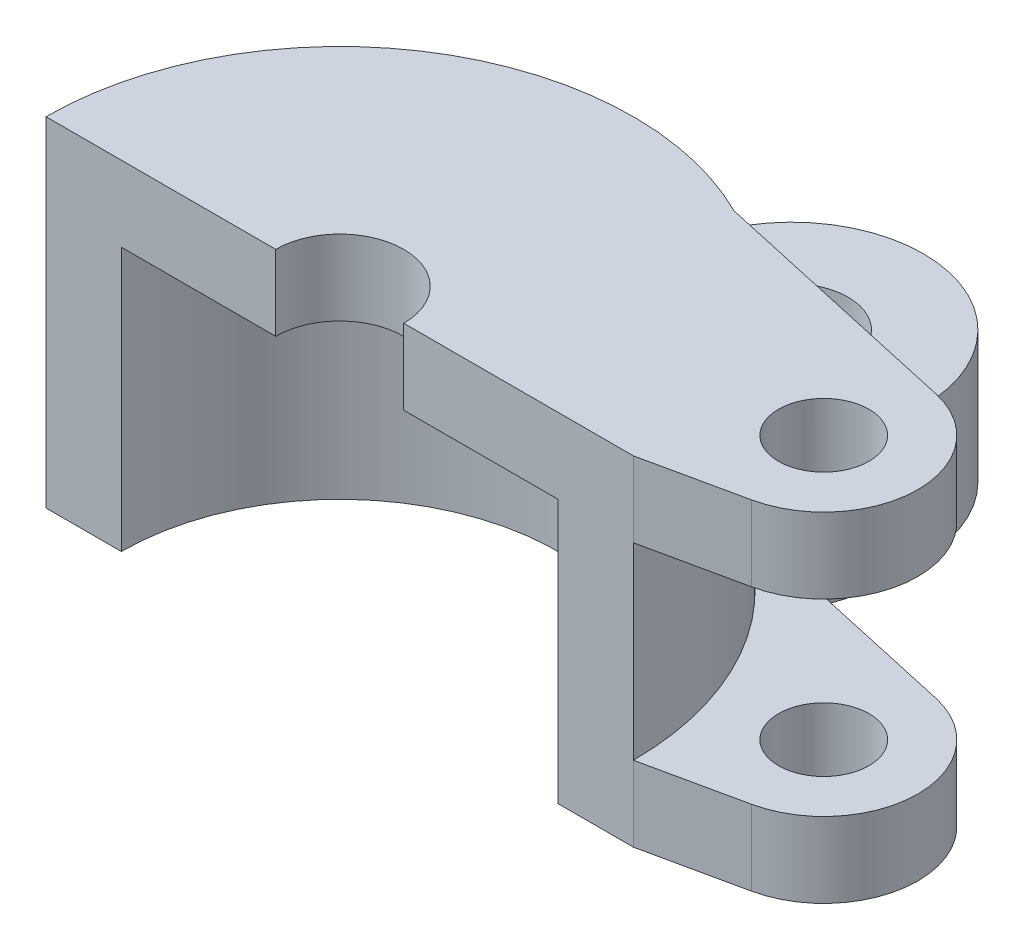
ISO-10303-21;
HEADER;
FILE_DESCRIPTION(('STEP AP214'),'2;1');
FILE_NAME('part.step','',(''),(''),'','','');
FILE_SCHEMA(('AUTOMOTIVE_DESIGN { 1 0 10303 214 1 1 1 1 }'));
ENDSEC;
DATA;
#1=APPLICATION_CONTEXT('core data for automotive mechanical design processes');
#2=APPLICATION_PROTOCOL_DEFINITION('international standard','automotive_design',2000,#1);
#3=PRODUCT_CONTEXT('',#1,'mechanical');
#4=PRODUCT('Part','Part','',(#3));
#5=PRODUCT_RELATED_PRODUCT_CATEGORY('part','',(#4));
#6=PRODUCT_DEFINITION_FORMATION('','',#4);
#7=PRODUCT_DEFINITION_CONTEXT('part definition',#1,'design');
#8=PRODUCT_DEFINITION('design','',#6,#7);
#9=PRODUCT_DEFINITION_SHAPE('','',#8);
#10=(LENGTH_UNIT() NAMED_UNIT(*) SI_UNIT(.MILLI.,.METRE.));
#11=(NAMED_UNIT(*) PLANE_ANGLE_UNIT() SI_UNIT($,.RADIAN.));
#12=(NAMED_UNIT(*) SI_UNIT($,.STERADIAN.) SOLID_ANGLE_UNIT());
#13=UNCERTAINTY_MEASURE_WITH_UNIT(LENGTH_MEASURE(1.E-05),#10,'distance_accuracy_value','');
#14=(GEOMETRIC_REPRESENTATION_CONTEXT(3) GLOBAL_UNCERTAINTY_ASSIGNED_CONTEXT((#13)) GLOBAL_UNIT_ASSIGNED_CONTEXT((#10,
#11,#12)) REPRESENTATION_CONTEXT('',''));
#15=CARTESIAN_POINT('',(0.,0.,0.));
#16=DIRECTION('',(0.,0.,1.));
#17=DIRECTION('',(1.,0.,0.));
#18=AXIS2_PLACEMENT_3D('',#15,#16,#17);
#19=CARTESIAN_POINT('',(7.8,20.2682362594864,0.));
#20=DIRECTION('',(0.21069833227543,0.,0.977551130517659));
#21=DIRECTION('',(0.977551130517659,0.,-0.21069833227543));
#22=AXIS2_PLACEMENT_3D('',#19,#20,#21);
#23=PLANE('',#22);
#24=DIRECTION('',(0.,-1.,0.));
#25=VECTOR('',#24,1.);
#26=CARTESIAN_POINT('',(7.8,7.,0.));
#27=LINE('',#26,#25);
#28=CARTESIAN_POINT('',(7.8,9.,0.));
#29=VERTEX_POINT('',#28);
#30=CARTESIAN_POINT('',(7.8,7.,0.));
#31=VERTEX_POINT('',#30);
#32=EDGE_CURVE('E215',#29,#31,#27,.T.);
#33=ORIENTED_EDGE('',*,*,#32,.T.);
#34=DIRECTION('',(-0.977551130517659,0.,0.21069833227543));
#35=VECTOR('',#34,1.);
#36=CARTESIAN_POINT('',(10.3801716308862,7.,-0.556122173705854));
#37=LINE('',#36,#35);
#38=CARTESIAN_POINT('',(10.3801716308862,7.,-0.556122173705854));
#39=VERTEX_POINT('',#38);
#40=EDGE_CURVE('E199',#39,#31,#37,.T.);
#41=ORIENTED_EDGE('',*,*,#40,.F.);
#42=DIRECTION('',(0.,-1.,0.));
#43=VECTOR('',#42,1.);
#44=CARTESIAN_POINT('',(10.3801716308862,20.2682362594864,-0.556122173705854));
#45=LINE('',#44,#43);
#46=CARTESIAN_POINT('',(10.3801716308862,9.,-0.556122173705854));
#47=VERTEX_POINT('',#46);
#48=EDGE_CURVE('E212',#47,#39,#45,.T.);
#49=ORIENTED_EDGE('',*,*,#48,.F.);
#50=DIRECTION('',(-0.977551130517659,0.,0.21069833227543));
#51=VECTOR('',#50,1.);
#52=CARTESIAN_POINT('',(7.8,9.,0.));
#53=LINE('',#52,#51);
#54=EDGE_CURVE('E241',#47,#29,#53,.T.);
#55=ORIENTED_EDGE('',*,*,#54,.T.);
#56=EDGE_LOOP('',(#33,#41,#49,#55));
#57=FACE_BOUND('',#56,.T.);
#58=ADVANCED_FACE('F42',(#57),#23,.T.);
#59=CARTESIAN_POINT('',(9.85342580019761,20.2682362594864,-3.));
#60=DIRECTION('',(0.,-1.,0.));
#61=DIRECTION('',(0.,0.,-1.));
#62=AXIS2_PLACEMENT_3D('',#59,#60,#61);
#63=CYLINDRICAL_SURFACE('',#62,2.5);
#64=ORIENTED_EDGE('',*,*,#48,.T.);
#65=CARTESIAN_POINT('',(9.85342580019761,7.,-3.));
#66=DIRECTION('',(0.,-1.,0.));
#67=DIRECTION('',(0.,0.,-1.));
#68=AXIS2_PLACEMENT_3D('',#65,#66,#67);
#69=CIRCLE('',#68,2.5);
#70=CARTESIAN_POINT('',(10.395008451767,7.,-5.44063275228352));
#71=VERTEX_POINT('',#70);
#72=EDGE_CURVE('E195',#71,#39,#69,.T.);
#73=ORIENTED_EDGE('',*,*,#72,.F.);
#74=DIRECTION('',(0.,-1.,0.));
#75=VECTOR('',#74,1.);
#76=CARTESIAN_POINT('',(10.395008451767,20.2682362594864,-5.44063275228352));
#77=LINE('',#76,#75);
#78=CARTESIAN_POINT('',(10.395008451767,9.,-5.44063275228352));
#79=VERTEX_POINT('',#78);
#80=EDGE_CURVE('E233',#79,#71,#77,.T.);
#81=ORIENTED_EDGE('',*,*,#80,.F.);
#82=CARTESIAN_POINT('',(9.85342580019761,9.,-3.));
#83=DIRECTION('',(0.,1.,0.));
#84=DIRECTION('',(0.,0.,1.));
#85=AXIS2_PLACEMENT_3D('',#82,#83,#84);
#86=CIRCLE('',#85,2.5);
#87=EDGE_CURVE('E220',#79,#47,#86,.F.);
#88=ORIENTED_EDGE('',*,*,#87,.T.);
#89=EDGE_LOOP('',(#64,#73,#81,#88));
#90=FACE_BOUND('',#89,.T.);
#91=ADVANCED_FACE('F219',(#90),#63,.T.);
#92=CARTESIAN_POINT('',(3.5,20.2682362594864,-6.97065276713738));
#93=DIRECTION('',(0.216633060627773,0.,-0.976253100913407));
#94=DIRECTION('',(-0.976253100913408,0.,-0.216633060627773));
#95=AXIS2_PLACEMENT_3D('',#92,#93,#94);
#96=PLANE('',#95);
#97=ORIENTED_EDGE('',*,*,#80,.T.);
#98=DIRECTION('',(0.976253100913407,0.,0.216633060627773));
#99=VECTOR('',#98,1.);
#100=CARTESIAN_POINT('',(3.5,7.,-6.97065276713738));
#101=LINE('',#100,#99);
#102=CARTESIAN_POINT('',(3.5,6.99999999999962,-6.97065276713738));
#103=VERTEX_POINT('',#102);
#104=EDGE_CURVE('E202',#103,#71,#101,.T.);
#105=ORIENTED_EDGE('',*,*,#104,.F.);
#106=DIRECTION('',(0.,-1.,0.));
#107=VECTOR('',#106,1.);
#108=CARTESIAN_POINT('',(3.5,20.2682362594864,-6.97065276713738));
#109=LINE('',#108,#107);
#110=CARTESIAN_POINT('',(3.5,9.,-6.97065276713738));
#111=VERTEX_POINT('',#110);
#112=EDGE_CURVE('E237',#111,#103,#109,.T.);
#113=ORIENTED_EDGE('',*,*,#112,.F.);
#114=DIRECTION('',(0.976253100913408,0.,0.216633060627773));
#115=VECTOR('',#114,1.);
#116=CARTESIAN_POINT('',(3.5,9.,-6.97065276713738));
#117=LINE('',#116,#115);
#118=EDGE_CURVE('E222',#111,#79,#117,.T.);
#119=ORIENTED_EDGE('',*,*,#118,.T.);
#120=EDGE_LOOP('',(#97,#105,#113,#119));
#121=FACE_BOUND('',#120,.T.);
#122=ADVANCED_FACE('F457',(#121),#96,.T.);
#123=CARTESIAN_POINT('',(9.85342580019761,20.2682362594864,-3.));
#124=DIRECTION('',(0.,-1.,0.));
#125=DIRECTION('',(0.,0.,-1.));
#126=AXIS2_PLACEMENT_3D('',#123,#124,#125);
#127=CYLINDRICAL_SURFACE('',#126,1.2);
#128=CARTESIAN_POINT('',(9.85342580019761,9.,-3.));
#129=DIRECTION('',(0.,1.,0.));
#130=DIRECTION('',(0.,0.,1.));
#131=AXIS2_PLACEMENT_3D('',#128,#129,#130);
#132=CIRCLE('',#131,1.2);
#133=CARTESIAN_POINT('',(9.85342580019761,9.,-1.8));
#134=VERTEX_POINT('',#133);
#135=EDGE_CURVE('E247',#134,#134,#132,.F.);
#136=ORIENTED_EDGE('',*,*,#135,.F.);
#137=EDGE_LOOP('',(#136));
#138=FACE_BOUND('',#137,.T.);
#139=CARTESIAN_POINT('',(9.85342580019761,7.,-3.));
#140=DIRECTION('',(0.,-1.,0.));
#141=DIRECTION('',(0.,0.,-1.));
#142=AXIS2_PLACEMENT_3D('',#139,#140,#141);
#143=CIRCLE('',#142,1.2);
#144=CARTESIAN_POINT('',(9.85342580019761,7.,-4.2));
#145=VERTEX_POINT('',#144);
#146=EDGE_CURVE('E510',#145,#145,#143,.F.);
#147=ORIENTED_EDGE('',*,*,#146,.F.);
#148=EDGE_LOOP('',(#147));
#149=FACE_BOUND('',#148,.T.);
#150=ADVANCED_FACE('F445',(#138,#149),#127,.F.);
#151=CARTESIAN_POINT('',(0.,7.,0.));
#152=DIRECTION('',(0.,-1.,0.));
#153=DIRECTION('',(0.,0.,-1.));
#154=AXIS2_PLACEMENT_3D('',#151,#152,#153);
#155=CYLINDRICAL_SURFACE('',#154,7.8);
#156=CARTESIAN_POINT('',(0.,9.,0.));
#157=DIRECTION('',(0.,1.,0.));
#158=DIRECTION('',(0.,0.,1.));
#159=AXIS2_PLACEMENT_3D('',#156,#157,#158);
#160=CIRCLE('',#159,7.8);
#161=CARTESIAN_POINT('',(-7.8,9.,0.));
#162=VERTEX_POINT('',#161);
#163=EDGE_CURVE('E285',#111,#162,#160,.T.);
#164=ORIENTED_EDGE('',*,*,#163,.F.);
#165=ORIENTED_EDGE('',*,*,#112,.T.);
#166=CARTESIAN_POINT('',(0.,7.,0.));
#167=DIRECTION('',(0.,-1.,0.));
#168=DIRECTION('',(0.,0.,-1.));
#169=AXIS2_PLACEMENT_3D('',#166,#167,#168);
#170=CIRCLE('',#169,7.8);
#171=CARTESIAN_POINT('',(-3.5,7.,-6.97065276713738));
#172=VERTEX_POINT('',#171);
#173=EDGE_CURVE('E356',#103,#172,#170,.F.);
#174=ORIENTED_EDGE('',*,*,#173,.T.);
#175=DIRECTION('',(0.,-1.,0.));
#176=VECTOR('',#175,1.);
#177=CARTESIAN_POINT('',(-3.5,2.,-6.97065276713738));
#178=LINE('',#177,#176);
#179=CARTESIAN_POINT('',(-3.5,0.,-6.97065276713738));
#180=VERTEX_POINT('',#179);
#181=EDGE_CURVE('E272',#172,#180,#178,.T.);
#182=ORIENTED_EDGE('',*,*,#181,.T.);
#183=CARTESIAN_POINT('',(0.,0.,0.));
#184=DIRECTION('',(0.,1.,0.));
#185=DIRECTION('',(0.,0.,1.));
#186=AXIS2_PLACEMENT_3D('',#183,#184,#185);
#187=CIRCLE('',#186,7.8);
#188=CARTESIAN_POINT('',(-7.8,0.,0.));
#189=VERTEX_POINT('',#188);
#190=EDGE_CURVE('E315',#180,#189,#187,.T.);
#191=ORIENTED_EDGE('',*,*,#190,.T.);
#192=DIRECTION('',(0.,-1.,0.));
#193=VECTOR('',#192,1.);
#194=CARTESIAN_POINT('',(-7.8,7.,0.));
#195=LINE('',#194,#193);
#196=EDGE_CURVE('E345',#162,#189,#195,.T.);
#197=ORIENTED_EDGE('',*,*,#196,.F.);
#198=EDGE_LOOP('',(#164,#165,#174,#182,#191,#197));
#199=FACE_BOUND('',#198,.T.);
#200=ADVANCED_FACE('F387',(#199),#155,.T.);
#201=CARTESIAN_POINT('',(-7.8,7.,0.));
#202=DIRECTION('',(0.,0.,-1.));
#203=DIRECTION('',(-1.,0.,0.));
#204=AXIS2_PLACEMENT_3D('',#201,#202,#203);
#205=PLANE('',#204);
#206=DIRECTION('',(1.,0.,0.));
#207=VECTOR('',#206,1.);
#208=CARTESIAN_POINT('',(-7.8,0.,0.));
#209=LINE('',#208,#207);
#210=CARTESIAN_POINT('',(-5.8,0.,0.));
#211=VERTEX_POINT('',#210);
#212=EDGE_CURVE('E326',#189,#211,#209,.T.);
#213=ORIENTED_EDGE('',*,*,#212,.T.);
#214=DIRECTION('',(0.,-1.,0.));
#215=VECTOR('',#214,1.);
#216=CARTESIAN_POINT('',(-5.8,7.,0.));
#217=LINE('',#216,#215);
#218=CARTESIAN_POINT('',(-5.8,7.,0.));
#219=VERTEX_POINT('',#218);
#220=EDGE_CURVE('E341',#219,#211,#217,.T.);
#221=ORIENTED_EDGE('',*,*,#220,.F.);
#222=DIRECTION('',(1.,0.,0.));
#223=VECTOR('',#222,1.);
#224=CARTESIAN_POINT('',(-7.8,7.,0.));
#225=LINE('',#224,#223);
#226=CARTESIAN_POINT('',(-1.7,7.,0.));
#227=VERTEX_POINT('',#226);
#228=EDGE_CURVE('E276',#219,#227,#225,.T.);
#229=ORIENTED_EDGE('',*,*,#228,.T.);
#230=DIRECTION('',(0.,-1.,0.));
#231=VECTOR('',#230,1.);
#232=CARTESIAN_POINT('',(-1.7,9.,0.));
#233=LINE('',#232,#231);
#234=CARTESIAN_POINT('',(-1.7,9.,0.));
#235=VERTEX_POINT('',#234);
#236=EDGE_CURVE('E311',#235,#227,#233,.T.);
#237=ORIENTED_EDGE('',*,*,#236,.F.);
#238=DIRECTION('',(1.,0.,0.));
#239=VECTOR('',#238,1.);
#240=CARTESIAN_POINT('',(-7.8,9.,0.));
#241=LINE('',#240,#239);
#242=EDGE_CURVE('E288',#162,#235,#241,.T.);
#243=ORIENTED_EDGE('',*,*,#242,.F.);
#244=ORIENTED_EDGE('',*,*,#196,.T.);
#245=EDGE_LOOP('',(#213,#221,#229,#237,#243,#244));
#246=FACE_BOUND('',#245,.T.);
#247=ADVANCED_FACE('F546',(#246),#205,.F.);
#248=CARTESIAN_POINT('',(0.,7.,0.));
#249=DIRECTION('',(0.,-1.,0.));
#250=DIRECTION('',(0.,0.,-1.));
#251=AXIS2_PLACEMENT_3D('',#248,#249,#250);
#252=CYLINDRICAL_SURFACE('',#251,5.8);
#253=CARTESIAN_POINT('',(0.,0.,0.));
#254=DIRECTION('',(0.,-1.,0.));
#255=DIRECTION('',(0.,0.,1.));
#256=AXIS2_PLACEMENT_3D('',#253,#254,#255);
#257=CIRCLE('',#256,5.8);
#258=CARTESIAN_POINT('',(5.8,0.,0.));
#259=VERTEX_POINT('',#258);
#260=EDGE_CURVE('E329',#211,#259,#257,.T.);
#261=ORIENTED_EDGE('',*,*,#260,.T.);
#262=DIRECTION('',(0.,-1.,0.));
#263=VECTOR('',#262,1.);
#264=CARTESIAN_POINT('',(5.8,7.,0.));
#265=LINE('',#264,#263);
#266=CARTESIAN_POINT('',(5.8,7.,0.));
#267=VERTEX_POINT('',#266);
#268=EDGE_CURVE('E337',#267,#259,#265,.T.);
#269=ORIENTED_EDGE('',*,*,#268,.F.);
#270=CARTESIAN_POINT('',(0.,7.,0.));
#271=DIRECTION('',(0.,-1.,0.));
#272=DIRECTION('',(0.,0.,1.));
#273=AXIS2_PLACEMENT_3D('',#270,#271,#272);
#274=CIRCLE('',#273,5.8);
#275=EDGE_CURVE('E316',#219,#267,#274,.T.);
#276=ORIENTED_EDGE('',*,*,#275,.F.);
#277=ORIENTED_EDGE('',*,*,#220,.T.);
#278=EDGE_LOOP('',(#261,#269,#276,#277));
#279=FACE_BOUND('',#278,.T.);
#280=ADVANCED_FACE('F618',(#279),#252,.F.);
#281=CARTESIAN_POINT('',(5.8,7.,0.));
#282=DIRECTION('',(0.,0.,-1.));
#283=DIRECTION('',(-1.,0.,0.));
#284=AXIS2_PLACEMENT_3D('',#281,#282,#283);
#285=PLANE('',#284);
#286=DIRECTION('',(1.,0.,0.));
#287=VECTOR('',#286,1.);
#288=CARTESIAN_POINT('',(5.8,0.,0.));
#289=LINE('',#288,#287);
#290=CARTESIAN_POINT('',(7.8,0.,0.));
#291=VERTEX_POINT('',#290);
#292=EDGE_CURVE('E321',#259,#291,#289,.T.);
#293=ORIENTED_EDGE('',*,*,#292,.T.);
#294=CARTESIAN_POINT('',(7.8,2.,0.));
#295=VERTEX_POINT('',#294);
#296=EDGE_CURVE('E320',#295,#291,#27,.T.);
#297=ORIENTED_EDGE('',*,*,#296,.F.);
#298=DIRECTION('',(0.,1.,0.));
#299=VECTOR('',#298,1.);
#300=CARTESIAN_POINT('',(7.8,2.,0.));
#301=LINE('',#300,#299);
#302=EDGE_CURVE('E507',#295,#31,#301,.T.);
#303=ORIENTED_EDGE('',*,*,#302,.T.);
#304=ORIENTED_EDGE('',*,*,#32,.F.);
#305=DIRECTION('',(1.,0.,0.));
#306=VECTOR('',#305,1.);
#307=CARTESIAN_POINT('',(7.8,9.,0.));
#308=LINE('',#307,#306);
#309=CARTESIAN_POINT('',(1.7,9.,0.));
#310=VERTEX_POINT('',#309);
#311=EDGE_CURVE('E295',#310,#29,#308,.T.);
#312=ORIENTED_EDGE('',*,*,#311,.F.);
#313=DIRECTION('',(0.,-1.,0.));
#314=VECTOR('',#313,1.);
#315=CARTESIAN_POINT('',(1.7,9.,0.));
#316=LINE('',#315,#314);
#317=CARTESIAN_POINT('',(1.7,7.,0.));
#318=VERTEX_POINT('',#317);
#319=EDGE_CURVE('E299',#310,#318,#316,.T.);
#320=ORIENTED_EDGE('',*,*,#319,.T.);
#321=DIRECTION('',(1.,0.,0.));
#322=VECTOR('',#321,1.);
#323=CARTESIAN_POINT('',(7.8,7.,0.));
#324=LINE('',#323,#322);
#325=EDGE_CURVE('E289',#318,#267,#324,.T.);
#326=ORIENTED_EDGE('',*,*,#325,.T.);
#327=ORIENTED_EDGE('',*,*,#268,.T.);
#328=EDGE_LOOP('',(#293,#297,#303,#304,#312,#320,#326,#327));
#329=FACE_BOUND('',#328,.T.);
#330=ADVANCED_FACE('F555',(#329),#285,.F.);
#331=CARTESIAN_POINT('',(0.,0.,0.));
#332=DIRECTION('',(0.,1.,0.));
#333=DIRECTION('',(0.,0.,1.));
#334=AXIS2_PLACEMENT_3D('',#331,#332,#333);
#335=PLANE('',#334);
#336=DIRECTION('',(0.,0.,-1.));
#337=VECTOR('',#336,1.);
#338=CARTESIAN_POINT('',(3.5,0.,0.));
#339=LINE('',#338,#337);
#340=CARTESIAN_POINT('',(3.5,0.,-6.97065276713738));
#341=VERTEX_POINT('',#340);
#342=CARTESIAN_POINT('',(3.5,0.,-10.7884197174563));
#343=VERTEX_POINT('',#342);
#344=EDGE_CURVE('E566',#341,#343,#339,.T.);
#345=ORIENTED_EDGE('',*,*,#344,.F.);
#346=DIRECTION('',(0.976253100913407,0.,0.216633060627773));
#347=VECTOR('',#346,1.);
#348=CARTESIAN_POINT('',(3.5,0.,-6.97065276713738));
#349=LINE('',#348,#347);
#350=CARTESIAN_POINT('',(10.395008451767,0.,-5.44063275228352));
#351=VERTEX_POINT('',#350);
#352=EDGE_CURVE('E496',#341,#351,#349,.T.);
#353=ORIENTED_EDGE('',*,*,#352,.T.);
#354=CARTESIAN_POINT('',(9.85342580019761,0.,-3.));
#355=DIRECTION('',(0.,-1.,0.));
#356=DIRECTION('',(0.,0.,-1.));
#357=AXIS2_PLACEMENT_3D('',#354,#355,#356);
#358=CIRCLE('',#357,2.5);
#359=CARTESIAN_POINT('',(10.3801716308862,0.,-0.556122173705854));
#360=VERTEX_POINT('',#359);
#361=EDGE_CURVE('E500',#351,#360,#358,.T.);
#362=ORIENTED_EDGE('',*,*,#361,.T.);
#363=DIRECTION('',(-0.977551130517659,0.,0.21069833227543));
#364=VECTOR('',#363,1.);
#365=CARTESIAN_POINT('',(7.8,0.,0.));
#366=LINE('',#365,#364);
#367=EDGE_CURVE('E492',#360,#291,#366,.T.);
#368=ORIENTED_EDGE('',*,*,#367,.T.);
#369=ORIENTED_EDGE('',*,*,#292,.F.);
#370=ORIENTED_EDGE('',*,*,#260,.F.);
#371=ORIENTED_EDGE('',*,*,#212,.F.);
#372=ORIENTED_EDGE('',*,*,#190,.F.);
#373=DIRECTION('',(0.,0.,1.));
#374=VECTOR('',#373,1.);
#375=CARTESIAN_POINT('',(-3.5,0.,0.));
#376=LINE('',#375,#374);
#377=CARTESIAN_POINT('',(-3.5,0.,-10.7884197174563));
#378=VERTEX_POINT('',#377);
#379=EDGE_CURVE('E67',#378,#180,#376,.T.);
#380=ORIENTED_EDGE('',*,*,#379,.F.);
#381=CARTESIAN_POINT('',(-0.499999999999999,0.,-10.7884197174563));
#382=DIRECTION('',(0.,1.,0.));
#383=DIRECTION('',(0.,0.,1.));
#384=AXIS2_PLACEMENT_3D('',#381,#382,#383);
#385=CIRCLE('',#384,3.);
#386=CARTESIAN_POINT('',(-0.36111111111111,0.,-7.79163646260733));
#387=VERTEX_POINT('',#386);
#388=EDGE_CURVE('E11',#378,#387,#385,.T.);
#389=ORIENTED_EDGE('',*,*,#388,.T.);
#390=CARTESIAN_POINT('',(0.361111111111112,0.,-7.79163646260733));
#391=VERTEX_POINT('',#390);
#392=EDGE_CURVE('E322',#391,#387,#187,.T.);
#393=ORIENTED_EDGE('',*,*,#392,.F.);
#394=CARTESIAN_POINT('',(0.500000000000001,0.,-10.7884197174563));
#395=DIRECTION('',(0.,1.,0.));
#396=DIRECTION('',(0.,0.,1.));
#397=AXIS2_PLACEMENT_3D('',#394,#395,#396);
#398=CIRCLE('',#397,3.);
#399=EDGE_CURVE('E52',#391,#343,#398,.T.);
#400=ORIENTED_EDGE('',*,*,#399,.T.);
#401=EDGE_LOOP('',(#345,#353,#362,#368,#369,#370,#371,#372,#380,#389,#393,#400));
#402=FACE_BOUND('',#401,.T.);
#403=CARTESIAN_POINT('',(9.85342580019761,0.,-3.));
#404=DIRECTION('',(0.,-1.,0.));
#405=DIRECTION('',(0.,0.,-1.));
#406=AXIS2_PLACEMENT_3D('',#403,#404,#405);
#407=CIRCLE('',#406,1.2);
#408=CARTESIAN_POINT('',(9.85342580019761,0.,-4.2));
#409=VERTEX_POINT('',#408);
#410=EDGE_CURVE('E236',#409,#409,#407,.T.);
#411=ORIENTED_EDGE('',*,*,#410,.F.);
#412=EDGE_LOOP('',(#411));
#413=FACE_BOUND('',#412,.T.);
#414=ADVANCED_FACE('F563',(#402,#413),#335,.F.);
#415=CARTESIAN_POINT('',(0.,7.,0.));
#416=DIRECTION('',(0.,1.,0.));
#417=DIRECTION('',(0.,0.,1.));
#418=AXIS2_PLACEMENT_3D('',#415,#416,#417);
#419=PLANE('',#418);
#420=ORIENTED_EDGE('',*,*,#228,.F.);
#421=ORIENTED_EDGE('',*,*,#275,.T.);
#422=ORIENTED_EDGE('',*,*,#325,.F.);
#423=CARTESIAN_POINT('',(0.,7.,0.));
#424=DIRECTION('',(0.,-1.,0.));
#425=DIRECTION('',(0.,0.,1.));
#426=AXIS2_PLACEMENT_3D('',#423,#424,#425);
#427=CIRCLE('',#426,1.7);
#428=EDGE_CURVE('E302',#227,#318,#427,.T.);
#429=ORIENTED_EDGE('',*,*,#428,.F.);
#430=EDGE_LOOP('',(#420,#421,#422,#429));
#431=FACE_BOUND('',#430,.T.);
#432=ADVANCED_FACE('F609',(#431),#419,.F.);
#433=CARTESIAN_POINT('',(0.,9.,0.));
#434=DIRECTION('',(0.,-1.,0.));
#435=DIRECTION('',(0.,0.,-1.));
#436=AXIS2_PLACEMENT_3D('',#433,#434,#435);
#437=CYLINDRICAL_SURFACE('',#436,1.7);
#438=ORIENTED_EDGE('',*,*,#428,.T.);
#439=ORIENTED_EDGE('',*,*,#319,.F.);
#440=CARTESIAN_POINT('',(0.,9.,0.));
#441=DIRECTION('',(0.,-1.,0.));
#442=DIRECTION('',(0.,0.,1.));
#443=AXIS2_PLACEMENT_3D('',#440,#441,#442);
#444=CIRCLE('',#443,1.7);
#445=EDGE_CURVE('E292',#235,#310,#444,.T.);
#446=ORIENTED_EDGE('',*,*,#445,.F.);
#447=ORIENTED_EDGE('',*,*,#236,.T.);
#448=EDGE_LOOP('',(#438,#439,#446,#447));
#449=FACE_BOUND('',#448,.T.);
#450=ADVANCED_FACE('F551',(#449),#437,.F.);
#451=CARTESIAN_POINT('',(0.,9.,0.));
#452=DIRECTION('',(0.,1.,0.));
#453=DIRECTION('',(0.,0.,1.));
#454=AXIS2_PLACEMENT_3D('',#451,#452,#453);
#455=PLANE('',#454);
#456=ORIENTED_EDGE('',*,*,#311,.T.);
#457=ORIENTED_EDGE('',*,*,#54,.F.);
#458=ORIENTED_EDGE('',*,*,#87,.F.);
#459=ORIENTED_EDGE('',*,*,#118,.F.);
#460=ORIENTED_EDGE('',*,*,#163,.T.);
#461=ORIENTED_EDGE('',*,*,#242,.T.);
#462=ORIENTED_EDGE('',*,*,#445,.T.);
#463=EDGE_LOOP('',(#456,#457,#458,#459,#460,#461,#462));
#464=FACE_BOUND('',#463,.T.);
#465=ORIENTED_EDGE('',*,*,#135,.T.);
#466=EDGE_LOOP('',(#465));
#467=FACE_BOUND('',#466,.T.);
#468=ADVANCED_FACE('F431',(#464,#467),#455,.T.);
#469=CARTESIAN_POINT('',(0.,2.,0.));
#470=DIRECTION('',(0.,-1.,0.));
#471=DIRECTION('',(0.,0.,-1.));
#472=AXIS2_PLACEMENT_3D('',#469,#470,#471);
#473=CYLINDRICAL_SURFACE('',#472,7.8);
#474=CARTESIAN_POINT('',(0.,-1.5,0.));
#475=DIRECTION('',(0.,-1.,0.));
#476=DIRECTION('',(0.,0.,-1.));
#477=AXIS2_PLACEMENT_3D('',#474,#475,#476);
#478=CIRCLE('',#477,7.8);
#479=CARTESIAN_POINT('',(-0.36111111111111,-1.5,-7.79163646260733));
#480=VERTEX_POINT('',#479);
#481=CARTESIAN_POINT('',(0.361111111111112,-1.5,-7.79163646260733));
#482=VERTEX_POINT('',#481);
#483=EDGE_CURVE('E259',#480,#482,#478,.T.);
#484=ORIENTED_EDGE('',*,*,#483,.T.);
#485=DIRECTION('',(0.,-1.,0.));
#486=VECTOR('',#485,1.);
#487=CARTESIAN_POINT('',(0.361111111111112,2.,-7.79163646260733));
#488=LINE('',#487,#486);
#489=EDGE_CURVE('E588',#482,#391,#488,.F.);
#490=ORIENTED_EDGE('',*,*,#489,.T.);
#491=ORIENTED_EDGE('',*,*,#392,.T.);
#492=DIRECTION('',(0.,-1.,0.));
#493=VECTOR('',#492,1.);
#494=CARTESIAN_POINT('',(-0.36111111111111,2.,-7.79163646260733));
#495=LINE('',#494,#493);
#496=EDGE_CURVE('E584',#387,#480,#495,.T.);
#497=ORIENTED_EDGE('',*,*,#496,.T.);
#498=EDGE_LOOP('',(#484,#490,#491,#497));
#499=FACE_BOUND('',#498,.T.);
#500=ADVANCED_FACE('F418',(#499),#473,.F.);
#501=CARTESIAN_POINT('',(-3.5,2.,0.));
#502=DIRECTION('',(1.,0.,0.));
#503=DIRECTION('',(0.,0.,-1.));
#504=AXIS2_PLACEMENT_3D('',#501,#502,#503);
#505=PLANE('',#504);
#506=DIRECTION('',(0.,0.,1.));
#507=VECTOR('',#506,1.);
#508=CARTESIAN_POINT('',(-3.5,-1.5,0.));
#509=LINE('',#508,#507);
#510=CARTESIAN_POINT('',(-3.5,-1.5,-12.));
#511=VERTEX_POINT('',#510);
#512=CARTESIAN_POINT('',(-3.5,-1.5,-10.7884197174563));
#513=VERTEX_POINT('',#512);
#514=EDGE_CURVE('E246',#511,#513,#509,.T.);
#515=ORIENTED_EDGE('',*,*,#514,.T.);
#516=DIRECTION('',(0.,-1.,0.));
#517=VECTOR('',#516,1.);
#518=CARTESIAN_POINT('',(-3.5,2.,-10.7884197174563));
#519=LINE('',#518,#517);
#520=EDGE_CURVE('E593',#513,#378,#519,.F.);
#521=ORIENTED_EDGE('',*,*,#520,.T.);
#522=ORIENTED_EDGE('',*,*,#379,.T.);
#523=ORIENTED_EDGE('',*,*,#181,.F.);
#524=CARTESIAN_POINT('',(-3.5,7.,-6.97065276713738));
#525=CARTESIAN_POINT('',(-3.5,6.86823671626228,-6.9706218991886));
#526=CARTESIAN_POINT('',(-3.5,6.73648547428623,-6.97647967766274));
#527=CARTESIAN_POINT('',(-3.5,6.47405745796886,-6.99974126741131));
#528=CARTESIAN_POINT('',(-3.5,6.34338027407757,-7.01714044928466));
#529=CARTESIAN_POINT('',(-3.5,6.0845976502858,-7.06315539428935));
#530=CARTESIAN_POINT('',(-3.5,5.95648360664042,-7.09172290616116));
#531=CARTESIAN_POINT('',(-3.5,5.7031532246982,-7.15966433827299));
#532=CARTESIAN_POINT('',(-3.5,5.57793707402591,-7.1990389561102));
#533=CARTESIAN_POINT('',(-3.5,5.33140655298456,-7.288024226344));
#534=CARTESIAN_POINT('',(-3.5,5.21008667260468,-7.33761961487014));
#535=CARTESIAN_POINT('',(-3.5,4.9718584250637,-7.44650006056829));
#536=CARTESIAN_POINT('',(-3.5,4.85495174101407,-7.50578876954371));
#537=CARTESIAN_POINT('',(-3.5,4.5117259263191,-7.69735525109701));
#538=CARTESIAN_POINT('',(-3.5,4.29289316035297,-7.84333626331792));
#539=CARTESIAN_POINT('',(-3.5,3.86788502205746,-8.17591703058829));
#540=CARTESIAN_POINT('',(-3.5,3.66318277304708,-8.36438335986996));
#541=CARTESIAN_POINT('',(-3.5,3.28511694545256,-8.77055002971868));
#542=CARTESIAN_POINT('',(-3.5,3.11176534881782,-8.98826149235577));
#543=CARTESIAN_POINT('',(-3.5,2.78615399876281,-9.46735093819537));
#544=CARTESIAN_POINT('',(-3.5,2.63705875204207,-9.73088198912312));
#545=CARTESIAN_POINT('',(-3.5,2.38367485518992,-10.2785772557246));
#546=CARTESIAN_POINT('',(-3.5,2.27936173557937,-10.5627301039187));
#547=CARTESIAN_POINT('',(-3.5,2.14709635179676,-11.0405295466162));
#548=CARTESIAN_POINT('',(-3.5,2.1051805605681,-11.2304212997973));
#549=CARTESIAN_POINT('',(-3.5,2.0417315507288,-11.6133114646566));
#550=CARTESIAN_POINT('',(-3.5,2.02017071620863,-11.8063053048567));
#551=CARTESIAN_POINT('',(-3.5,2.00900811461289,-12.));
#552=B_SPLINE_CURVE_WITH_KNOTS('',3,(#524,#525,#526,#527,#528,#529,#530,#531,#532,#533,#534,
#535,#536,#537,#538,#539,#540,#541,#542,#543,#544,#545,#546,#547,#548,#549,#550,#551),
.UNSPECIFIED.,.F.,.F.,(4,2,2,2,2,2,2,2,2,2,2,2,2,4),(0.,0.395140779767936,0.790123159396702,
1.18341760122884,1.57673743613589,1.96947408277316,2.36235902904348,3.14810405618437,
3.9794809509514,4.81117492239391,5.71550858161135,6.61934747143437,7.20172171769979,
7.78330470680458),.UNSPECIFIED.);
#553=CARTESIAN_POINT('',(-3.5,2.00900811461289,-12.));
#554=VERTEX_POINT('',#553);
#555=EDGE_CURVE('E401',#172,#554,#552,.T.);
#556=ORIENTED_EDGE('',*,*,#555,.T.);
#557=DIRECTION('',(0.,-1.,0.));
#558=VECTOR('',#557,1.);
#559=CARTESIAN_POINT('',(-3.5,2.,-12.));
#560=LINE('',#559,#558);
#561=EDGE_CURVE('E271',#554,#511,#560,.T.);
#562=ORIENTED_EDGE('',*,*,#561,.T.);
#563=EDGE_LOOP('',(#515,#521,#522,#523,#556,#562));
#564=FACE_BOUND('',#563,.T.);
#565=ADVANCED_FACE('F414',(#564),#505,.F.);
#566=CARTESIAN_POINT('',(3.5,2.,0.));
#567=DIRECTION('',(1.,0.,0.));
#568=DIRECTION('',(0.,0.,-1.));
#569=AXIS2_PLACEMENT_3D('',#566,#567,#568);
#570=PLANE('',#569);
#571=ORIENTED_EDGE('',*,*,#344,.T.);
#572=DIRECTION('',(0.,1.,0.));
#573=VECTOR('',#572,1.);
#574=CARTESIAN_POINT('',(3.5,-1.5,-10.7884197174563));
#575=LINE('',#574,#573);
#576=CARTESIAN_POINT('',(3.5,-1.5,-10.7884197174563));
#577=VERTEX_POINT('',#576);
#578=EDGE_CURVE('E575',#343,#577,#575,.F.);
#579=ORIENTED_EDGE('',*,*,#578,.T.);
#580=DIRECTION('',(0.,0.,1.));
#581=VECTOR('',#580,1.);
#582=CARTESIAN_POINT('',(3.5,-1.5,0.));
#583=LINE('',#582,#581);
#584=CARTESIAN_POINT('',(3.5,-1.5,-12.));
#585=VERTEX_POINT('',#584);
#586=EDGE_CURVE('E255',#585,#577,#583,.T.);
#587=ORIENTED_EDGE('',*,*,#586,.F.);
#588=DIRECTION('',(0.,-1.,0.));
#589=VECTOR('',#588,1.);
#590=CARTESIAN_POINT('',(3.5,2.,-12.));
#591=LINE('',#590,#589);
#592=CARTESIAN_POINT('',(3.5,2.00900811461289,-12.));
#593=VERTEX_POINT('',#592);
#594=EDGE_CURVE('E280',#593,#585,#591,.T.);
#595=ORIENTED_EDGE('',*,*,#594,.F.);
#596=CARTESIAN_POINT('',(3.5,2.00900811461289,-12.));
#597=CARTESIAN_POINT('',(3.5,2.01793094000883,-11.8451307273015));
#598=CARTESIAN_POINT('',(3.5,2.03351137485017,-11.6906565412159));
#599=CARTESIAN_POINT('',(3.5,2.07771238803744,-11.3836061783583));
#600=CARTESIAN_POINT('',(3.5,2.10633109733114,-11.2310297327623));
#601=CARTESIAN_POINT('',(3.5,2.17631450990522,-10.9289317281104));
#602=CARTESIAN_POINT('',(3.5,2.21767126825504,-10.7794083266331));
#603=CARTESIAN_POINT('',(3.5,2.31278234073056,-10.4843556267896));
#604=CARTESIAN_POINT('',(3.5,2.36653691907595,-10.3388264136207));
#605=CARTESIAN_POINT('',(3.5,2.486028369042,-10.0528006521842));
#606=CARTESIAN_POINT('',(3.5,2.55176335440607,-9.91230331583284));
#607=CARTESIAN_POINT('',(3.5,2.69479148252029,-9.63725785324691));
#608=CARTESIAN_POINT('',(3.5,2.77208860264163,-9.5027117949684));
#609=CARTESIAN_POINT('',(3.5,2.93772315645795,-9.24060118500103));
#610=CARTESIAN_POINT('',(3.5,3.02606013838755,-9.11303634793856));
#611=CARTESIAN_POINT('',(3.5,3.21323386715555,-8.86585881396364));
#612=CARTESIAN_POINT('',(3.5,3.31207027930276,-8.74624586376573));
#613=CARTESIAN_POINT('',(3.5,3.51974488357441,-8.51585413860501));
#614=CARTESIAN_POINT('',(3.5,3.628591309825,-8.40508277908586));
#615=CARTESIAN_POINT('',(3.5,3.85552201256424,-8.1935349591479));
#616=CARTESIAN_POINT('',(3.5,3.97360231487143,-8.09275424073421));
#617=CARTESIAN_POINT('',(3.5,4.21839874176892,-7.90210149306975));
#618=CARTESIAN_POINT('',(3.5,4.34512042100704,-7.81223658566191));
#619=CARTESIAN_POINT('',(3.5,4.60623899141991,-7.64458743580362));
#620=CARTESIAN_POINT('',(3.5,4.74063169205117,-7.56679668222845));
#621=CARTESIAN_POINT('',(3.5,5.00838216858371,-7.4283258090906));
#622=CARTESIAN_POINT('',(3.5,5.1413678441795,-7.36692635185127));
#623=CARTESIAN_POINT('',(3.5,5.41235971797762,-7.25663422379488));
#624=CARTESIAN_POINT('',(3.5,5.55036312917021,-7.20773472774493));
#625=CARTESIAN_POINT('',(3.5,5.8300735838419,-7.12324804357175));
#626=CARTESIAN_POINT('',(3.5,5.97177225104917,-7.08763314570175));
#627=CARTESIAN_POINT('',(3.5,6.25786721606293,-7.03019911293064));
#628=CARTESIAN_POINT('',(3.5,6.40226153651191,-7.00837024552492));
#629=CARTESIAN_POINT('',(3.5,6.62257307414056,-6.98597144819146));
#630=CARTESIAN_POINT('',(3.5,6.69799630393872,-6.98022623117015));
#631=CARTESIAN_POINT('',(3.5,6.84894238794852,-6.97256856610466));
#632=CARTESIAN_POINT('',(3.5,6.92446499949557,-6.97065133229729));
#633=CARTESIAN_POINT('',(3.5,7.,-6.97065276713738));
#634=B_SPLINE_CURVE_WITH_KNOTS('',3,(#596,#597,#598,#599,#600,#601,#602,#603,#604,#605,#606,
#607,#608,#609,#610,#611,#612,#613,#614,#615,#616,#617,#618,#619,#620,#621,#622,#623,#624,#625,
#626,#627,#628,#629,#630,#631,#632,#633),.UNSPECIFIED.,.F.,.F.,(4,2,2,2,2,2,2,2,2,2,2,2,2,2,2,2,
2,2,4),(0.,0.465219970828406,0.930373272791159,1.39523703649794,1.86011070819743,
2.32491125093734,2.78987205422154,3.25481383693627,3.71974080310915,4.18505369350236,
4.65016740790594,5.11558296656314,5.58074666600968,6.01957744290483,6.45816809498287,
6.89583872571925,7.33320002832309,7.56004000159088,7.78659620040014),.UNSPECIFIED.);
#635=EDGE_CURVE('E394',#593,#103,#634,.T.);
#636=ORIENTED_EDGE('',*,*,#635,.T.);
#637=DIRECTION('',(0.,-1.,0.));
#638=VECTOR('',#637,1.);
#639=CARTESIAN_POINT('',(3.5,2.,-6.97065276713738));
#640=LINE('',#639,#638);
#641=CARTESIAN_POINT('',(3.5,2.,-6.97065276713738));
#642=VERTEX_POINT('',#641);
#643=EDGE_CURVE('E277',#103,#642,#640,.T.);
#644=ORIENTED_EDGE('',*,*,#643,.T.);
#645=EDGE_CURVE('E60',#642,#341,#640,.T.);
#646=ORIENTED_EDGE('',*,*,#645,.T.);
#647=EDGE_LOOP('',(#571,#579,#587,#595,#636,#644,#646));
#648=FACE_BOUND('',#647,.T.);
#649=ADVANCED_FACE('F417',(#648),#570,.T.);
#650=CARTESIAN_POINT('',(0.,2.,-12.));
#651=DIRECTION('',(0.,-1.,0.));
#652=DIRECTION('',(0.,0.,-1.));
#653=AXIS2_PLACEMENT_3D('',#650,#651,#652);
#654=CYLINDRICAL_SURFACE('',#653,1.5);
#655=CARTESIAN_POINT('',(0.,2.,-12.));
#656=DIRECTION('',(0.,-1.,0.));
#657=DIRECTION('',(0.,0.,-1.));
#658=AXIS2_PLACEMENT_3D('',#655,#656,#657);
#659=CIRCLE('',#658,1.5);
#660=CARTESIAN_POINT('',(-1.30875252042631,2.,-12.7329166666667));
#661=VERTEX_POINT('',#660);
#662=CARTESIAN_POINT('',(1.30875252042631,2.,-12.7329166666667));
#663=VERTEX_POINT('',#662);
#664=EDGE_CURVE('E263',#661,#663,#659,.T.);
#665=ORIENTED_EDGE('',*,*,#664,.F.);
#666=CARTESIAN_POINT('',(-1.30875252042631,2.,-12.7329166666667));
#667=CARTESIAN_POINT('',(-1.32875174538573,1.99999952994558,-12.6972047949433));
#668=CARTESIAN_POINT('',(-1.34727914114004,2.00033674474429,-12.6606893996074));
#669=CARTESIAN_POINT('',(-1.38128595752744,2.00178556769655,-12.5862799273691));
#670=CARTESIAN_POINT('',(-1.39676530197976,2.00289719520207,-12.5483858160361));
#671=CARTESIAN_POINT('',(-1.43841618747054,2.00753584829923,-12.4331389770261));
#672=CARTESIAN_POINT('',(-1.45988369410719,2.01236583518955,-12.3540729273001));
#673=CARTESIAN_POINT('',(-1.4896633170332,2.02603763171077,-12.1938070322853));
#674=CARTESIAN_POINT('',(-1.49796394158143,2.03488293716713,-12.1126053858547));
#675=CARTESIAN_POINT('',(-1.50137202279643,2.05675345860904,-11.9505117862413));
#676=CARTESIAN_POINT('',(-1.49648317962454,2.0697775013922,-11.8696197525758));
#677=CARTESIAN_POINT('',(-1.47396288837896,2.09978235603457,-11.7103205249644));
#678=CARTESIAN_POINT('',(-1.4563188009529,2.1167670812725,-11.6319158763093));
#679=CARTESIAN_POINT('',(-1.40909832876559,2.15405650233442,-11.4796108956089));
#680=CARTESIAN_POINT('',(-1.37951687163571,2.17436260727886,-11.4057124937204));
#681=CARTESIAN_POINT('',(-1.30776078232382,2.21834593915317,-11.2606634478528));
#682=CARTESIAN_POINT('',(-1.26505301738167,2.24213772884833,-11.1898117563012));
#683=CARTESIAN_POINT('',(-1.16883778875848,2.2908588384061,-11.0562852960651));
#684=CARTESIAN_POINT('',(-1.11532547347188,2.31578866537984,-10.9936142216415));
#685=CARTESIAN_POINT('',(-0.995028220471856,2.36656942558473,-10.8741491834907));
#686=CARTESIAN_POINT('',(-0.927628534705959,2.39238243353168,-10.8179554870098));
#687=CARTESIAN_POINT('',(-0.783275829991527,2.44091847386286,-10.7177380676374));
#688=CARTESIAN_POINT('',(-0.706322342379554,2.46364135454568,-10.6737149421176));
#689=CARTESIAN_POINT('',(-0.546513041479579,2.50284825292664,-10.6004075187056));
#690=CARTESIAN_POINT('',(-0.463843504709733,2.51946907342423,-10.5707944576239));
#691=CARTESIAN_POINT('',(-0.293506450554873,2.54483175058378,-10.5263756942753));
#692=CARTESIAN_POINT('',(-0.205846894507631,2.55358580332551,-10.5115470673472));
#693=CARTESIAN_POINT('',(-0.040319044225079,2.5612587945388,-10.4985481257678));
#694=CARTESIAN_POINT('',(0.0373521278317354,2.56130164374795,-10.4984742001832));
#695=CARTESIAN_POINT('',(0.191458197041567,2.554343752325,-10.5102642206049));
#696=CARTESIAN_POINT('',(0.267893102111498,2.54734305681713,-10.5221280901322));
#697=CARTESIAN_POINT('',(0.413275893041063,2.52774291759005,-10.5562243877754));
#698=CARTESIAN_POINT('',(0.482405964111141,2.51545904646043,-10.5778754712296));
#699=CARTESIAN_POINT('',(0.616074998501904,2.48663823085765,-10.6304691816413));
#700=CARTESIAN_POINT('',(0.680612556703593,2.47009999180567,-10.661414637302));
#701=CARTESIAN_POINT('',(0.810196105051083,2.43236864968078,-10.7352145368303));
#702=CARTESIAN_POINT('',(0.87465327604891,2.41087606839001,-10.778947776398));
#703=CARTESIAN_POINT('',(0.995725370750387,2.36620511197639,-10.8754853999187));
#704=CARTESIAN_POINT('',(1.05233586183624,2.34302579519355,-10.9282948736462));
#705=CARTESIAN_POINT('',(1.16280914400061,2.29389686049915,-11.0485365910331));
#706=CARTESIAN_POINT('',(1.21560179480489,2.26793609629646,-11.1169529013762));
#707=CARTESIAN_POINT('',(1.30892048542912,2.21781055501689,-11.2623104582947));
#708=CARTESIAN_POINT('',(1.34944482303681,2.19364602751609,-11.3392528858363));
#709=CARTESIAN_POINT('',(1.41713906284265,2.14844762902451,-11.5005686262464));
#710=CARTESIAN_POINT('',(1.44418561611176,2.12744386001347,-11.5850025317398));
#711=CARTESIAN_POINT('',(1.48304900939894,2.08997511700109,-11.7582650579149));
#712=CARTESIAN_POINT('',(1.49487350474603,2.07350786481673,-11.8470914462132));
#713=CARTESIAN_POINT('',(1.50220724395192,2.04656224285115,-12.0204736453106));
#714=CARTESIAN_POINT('',(1.49871118650103,2.03576830834025,-12.1049394405668));
#715=CARTESIAN_POINT('',(1.47744914655586,2.01862047520958,-12.2725121273169));
#716=CARTESIAN_POINT('',(1.45969085058539,2.01226418840208,-12.3556197261897));
#717=CARTESIAN_POINT('',(1.41937864763419,2.00511587408926,-12.4881250578592));
#718=CARTESIAN_POINT('',(1.40094132897762,2.00313969048905,-12.5387543637571));
#719=CARTESIAN_POINT('',(1.35876374737589,2.0005807004931,-12.6376927820155));
#720=CARTESIAN_POINT('',(1.33503224803579,1.99999560982957,-12.6860055702234));
#721=CARTESIAN_POINT('',(1.30875252042631,2.,-12.7329166666667));
#722=B_SPLINE_CURVE_WITH_KNOTS('',3,(#666,#667,#668,#669,#670,#671,#672,#673,#674,#675,#676,
#677,#678,#679,#680,#681,#682,#683,#684,#685,#686,#687,#688,#689,#690,#691,#692,#693,#694,#695,
#696,#697,#698,#699,#700,#701,#702,#703,#704,#705,#706,#707,#708,#709,#710,#711,#712,#713,#714,
#715,#716,#717,#718,#719,#720,#721),.UNSPECIFIED.,.F.,.F.,(4,2,2,2,2,2,2,2,2,2,2,2,2,2,2,2,2,2,
2,2,2,2,2,2,2,2,2,4),(0.,0.122718980297179,0.245441027354014,0.490380248433288,
0.735533129240645,0.980617242232678,1.22594454601814,1.47137620302851,1.72850853802644,
1.98575659188071,2.25885922293008,2.53197525637475,2.79852809701416,3.06466697648896,
3.29644382648485,3.52821919162012,3.74774066013927,3.96732900691355,4.20877476275166,
4.45035636108353,4.71980371295267,4.98928843317012,5.26119615347351,5.53296707510656,
5.78736383031395,6.04162357227662,6.20307362173688,6.36425837574519),.UNSPECIFIED.);
#723=EDGE_CURVE('E360',#661,#663,#722,.T.);
#724=ORIENTED_EDGE('',*,*,#723,.T.);
#725=EDGE_LOOP('',(#665,#724));
#726=FACE_BOUND('',#725,.T.);
#727=CARTESIAN_POINT('',(0.,-1.5,-12.));
#728=DIRECTION('',(0.,-1.,0.));
#729=DIRECTION('',(0.,0.,-1.));
#730=AXIS2_PLACEMENT_3D('',#727,#728,#729);
#731=CIRCLE('',#730,1.5);
#732=CARTESIAN_POINT('',(0.,-1.5,-13.5));
#733=VERTEX_POINT('',#732);
#734=EDGE_CURVE('E242',#733,#733,#731,.T.);
#735=ORIENTED_EDGE('',*,*,#734,.T.);
#736=EDGE_LOOP('',(#735));
#737=FACE_BOUND('',#736,.T.);
#738=ADVANCED_FACE('F376',(#726,#737),#654,.F.);
#739=CARTESIAN_POINT('',(0.,2.,-12.));
#740=DIRECTION('',(0.,-1.,0.));
#741=DIRECTION('',(0.,0.,-1.));
#742=AXIS2_PLACEMENT_3D('',#739,#740,#741);
#743=CYLINDRICAL_SURFACE('',#742,3.5);
#744=ORIENTED_EDGE('',*,*,#594,.T.);
#745=CARTESIAN_POINT('',(0.,-1.5,-12.));
#746=DIRECTION('',(0.,-1.,0.));
#747=DIRECTION('',(0.,0.,-1.));
#748=AXIS2_PLACEMENT_3D('',#745,#746,#747);
#749=CIRCLE('',#748,3.5);
#750=EDGE_CURVE('E251',#511,#585,#749,.T.);
#751=ORIENTED_EDGE('',*,*,#750,.F.);
#752=ORIENTED_EDGE('',*,*,#561,.F.);
#753=CARTESIAN_POINT('',(-3.5,2.00900811461289,-12.));
#754=CARTESIAN_POINT('',(-3.50000073679333,2.0059848239925,-12.052773025363));
#755=CARTESIAN_POINT('',(-3.49880802205714,2.00372250246168,-12.1055136973597));
#756=CARTESIAN_POINT('',(-3.49403568819285,2.00071979674059,-12.2109303640625));
#757=CARTESIAN_POINT('',(-3.49045606773146,1.99997941340044,-12.2636063587325));
#758=CARTESIAN_POINT('',(-3.48568299440727,2.,-12.31625));
#759=B_SPLINE_CURVE_WITH_KNOTS('',3,(#753,#754,#755,#756,#757,#758),.UNSPECIFIED.,.F.,.F.,(4,2,
4),(0.,0.158407930193981,0.316815948871889),.UNSPECIFIED.);
#760=CARTESIAN_POINT('',(-3.48568299440726,2.,-12.31625));
#761=VERTEX_POINT('',#760);
#762=EDGE_CURVE('E408',#554,#761,#759,.T.);
#763=ORIENTED_EDGE('',*,*,#762,.T.);
#764=CARTESIAN_POINT('',(0.,2.,-12.));
#765=DIRECTION('',(0.,-1.,0.));
#766=DIRECTION('',(0.,0.,-1.));
#767=AXIS2_PLACEMENT_3D('',#764,#765,#766);
#768=CIRCLE('',#767,3.5);
#769=CARTESIAN_POINT('',(3.48568299440727,2.,-12.31625));
#770=VERTEX_POINT('',#769);
#771=EDGE_CURVE('E267',#761,#770,#768,.T.);
#772=ORIENTED_EDGE('',*,*,#771,.T.);
#773=CARTESIAN_POINT('',(3.48568299440727,2.,-12.31625));
#774=CARTESIAN_POINT('',(3.49045606773146,1.99997941340044,-12.2636063587325));
#775=CARTESIAN_POINT('',(3.49403568819285,2.00071979674059,-12.2109303640625));
#776=CARTESIAN_POINT('',(3.49880802205715,2.00372250246168,-12.1055136973597));
#777=CARTESIAN_POINT('',(3.50000073679334,2.00598482399249,-12.052773025363));
#778=CARTESIAN_POINT('',(3.5,2.00900811461288,-12.));
#779=B_SPLINE_CURVE_WITH_KNOTS('',3,(#773,#774,#775,#776,#777,#778),.UNSPECIFIED.,.F.,.F.,(4,2,
4),(0.,0.15840801867791,0.316815948871891),.UNSPECIFIED.);
#780=EDGE_CURVE('E369',#770,#593,#779,.T.);
#781=ORIENTED_EDGE('',*,*,#780,.T.);
#782=EDGE_LOOP('',(#744,#751,#752,#763,#772,#781));
#783=FACE_BOUND('',#782,.T.);
#784=ADVANCED_FACE('F420',(#783),#743,.T.);
#785=CARTESIAN_POINT('',(0.,2.,0.));
#786=DIRECTION('',(0.,-1.,0.));
#787=DIRECTION('',(0.,0.,-1.));
#788=AXIS2_PLACEMENT_3D('',#785,#786,#787);
#789=PLANE('',#788);
#790=ORIENTED_EDGE('',*,*,#771,.F.);
#791=CARTESIAN_POINT('',(0.,2.,0.));
#792=DIRECTION('',(0.,-1.,0.));
#793=DIRECTION('',(0.,0.,-1.));
#794=AXIS2_PLACEMENT_3D('',#791,#792,#793);
#795=CIRCLE('',#794,12.8);
#796=EDGE_CURVE('E352',#761,#661,#795,.T.);
#797=ORIENTED_EDGE('',*,*,#796,.T.);
#798=ORIENTED_EDGE('',*,*,#664,.T.);
#799=CARTESIAN_POINT('',(0.,2.,0.));
#800=DIRECTION('',(0.,-1.,0.));
#801=DIRECTION('',(0.,0.,-1.));
#802=AXIS2_PLACEMENT_3D('',#799,#800,#801);
#803=CIRCLE('',#802,12.8);
#804=EDGE_CURVE('E349',#663,#770,#803,.T.);
#805=ORIENTED_EDGE('',*,*,#804,.T.);
#806=EDGE_LOOP('',(#790,#797,#798,#805));
#807=FACE_BOUND('',#806,.T.);
#808=ADVANCED_FACE('F423',(#807),#789,.F.);
#809=CARTESIAN_POINT('',(0.,-1.5,0.));
#810=DIRECTION('',(0.,-1.,0.));
#811=DIRECTION('',(0.,0.,-1.));
#812=AXIS2_PLACEMENT_3D('',#809,#810,#811);
#813=PLANE('',#812);
#814=ORIENTED_EDGE('',*,*,#734,.F.);
#815=EDGE_LOOP('',(#814));
#816=FACE_BOUND('',#815,.T.);
#817=ORIENTED_EDGE('',*,*,#586,.T.);
#818=CARTESIAN_POINT('',(0.500000000000001,-1.5,-10.7884197174563));
#819=DIRECTION('',(0.,-1.,0.));
#820=DIRECTION('',(0.,0.,-1.));
#821=AXIS2_PLACEMENT_3D('',#818,#819,#820);
#822=CIRCLE('',#821,3.);
#823=EDGE_CURVE('E581',#577,#482,#822,.T.);
#824=ORIENTED_EDGE('',*,*,#823,.T.);
#825=ORIENTED_EDGE('',*,*,#483,.F.);
#826=CARTESIAN_POINT('',(-0.499999999999999,-1.5,-10.7884197174563));
#827=DIRECTION('',(0.,-1.,0.));
#828=DIRECTION('',(0.,0.,-1.));
#829=AXIS2_PLACEMENT_3D('',#826,#827,#828);
#830=CIRCLE('',#829,3.);
#831=EDGE_CURVE('E578',#480,#513,#830,.T.);
#832=ORIENTED_EDGE('',*,*,#831,.T.);
#833=ORIENTED_EDGE('',*,*,#514,.F.);
#834=ORIENTED_EDGE('',*,*,#750,.T.);
#835=EDGE_LOOP('',(#817,#824,#825,#832,#833,#834));
#836=FACE_BOUND('',#835,.T.);
#837=ADVANCED_FACE('F385',(#816,#836),#813,.T.);
#838=CARTESIAN_POINT('',(0.,7.,0.));
#839=DIRECTION('',(0.,-1.,0.));
#840=DIRECTION('',(0.,0.,-1.));
#841=AXIS2_PLACEMENT_3D('',#838,#839,#840);
#842=TOROIDAL_SURFACE('',#841,12.8,5.);
#843=ORIENTED_EDGE('',*,*,#555,.F.);
#844=ORIENTED_EDGE('',*,*,#173,.F.);
#845=ORIENTED_EDGE('',*,*,#635,.F.);
#846=ORIENTED_EDGE('',*,*,#780,.F.);
#847=ORIENTED_EDGE('',*,*,#804,.F.);
#848=ORIENTED_EDGE('',*,*,#723,.F.);
#849=ORIENTED_EDGE('',*,*,#796,.F.);
#850=ORIENTED_EDGE('',*,*,#762,.F.);
#851=EDGE_LOOP('',(#843,#844,#845,#846,#847,#848,#849,#850));
#852=FACE_BOUND('',#851,.T.);
#853=ADVANCED_FACE('F380',(#852),#842,.F.);
#854=CARTESIAN_POINT('',(0.500000000000001,2.,-10.7884197174563));
#855=DIRECTION('',(0.,-1.,0.));
#856=DIRECTION('',(0.,0.,-1.));
#857=AXIS2_PLACEMENT_3D('',#854,#855,#856);
#858=CYLINDRICAL_SURFACE('',#857,3.);
#859=ORIENTED_EDGE('',*,*,#399,.F.);
#860=ORIENTED_EDGE('',*,*,#489,.F.);
#861=ORIENTED_EDGE('',*,*,#823,.F.);
#862=ORIENTED_EDGE('',*,*,#578,.F.);
#863=EDGE_LOOP('',(#859,#860,#861,#862));
#864=FACE_BOUND('',#863,.T.);
#865=ADVANCED_FACE('F384',(#864),#858,.T.);
#866=CARTESIAN_POINT('',(-0.499999999999999,2.,-10.7884197174563));
#867=DIRECTION('',(0.,-1.,0.));
#868=DIRECTION('',(0.,0.,-1.));
#869=AXIS2_PLACEMENT_3D('',#866,#867,#868);
#870=CYLINDRICAL_SURFACE('',#869,3.);
#871=ORIENTED_EDGE('',*,*,#388,.F.);
#872=ORIENTED_EDGE('',*,*,#520,.F.);
#873=ORIENTED_EDGE('',*,*,#831,.F.);
#874=ORIENTED_EDGE('',*,*,#496,.F.);
#875=EDGE_LOOP('',(#871,#872,#873,#874));
#876=FACE_BOUND('',#875,.T.);
#877=ADVANCED_FACE('F44',(#876),#870,.T.);
#878=DIRECTION('',(-0.977551130517659,0.,0.21069833227543));
#879=VECTOR('',#878,1.);
#880=CARTESIAN_POINT('',(10.3801716308862,2.,-0.556122173705854));
#881=LINE('',#880,#879);
#882=CARTESIAN_POINT('',(10.3801716308862,2.,-0.556122173705854));
#883=VERTEX_POINT('',#882);
#884=EDGE_CURVE('E518',#883,#295,#881,.T.);
#885=ORIENTED_EDGE('',*,*,#884,.T.);
#886=ORIENTED_EDGE('',*,*,#296,.T.);
#887=ORIENTED_EDGE('',*,*,#367,.F.);
#888=EDGE_CURVE('E223',#883,#360,#45,.T.);
#889=ORIENTED_EDGE('',*,*,#888,.F.);
#890=EDGE_LOOP('',(#885,#886,#887,#889));
#891=FACE_BOUND('',#890,.T.);
#892=ADVANCED_FACE('F446',(#891),#23,.T.);
#893=CARTESIAN_POINT('',(9.85342580019761,2.,-3.));
#894=DIRECTION('',(0.,-1.,0.));
#895=DIRECTION('',(0.,0.,-1.));
#896=AXIS2_PLACEMENT_3D('',#893,#894,#895);
#897=CIRCLE('',#896,2.5);
#898=CARTESIAN_POINT('',(10.395008451767,2.,-5.44063275228352));
#899=VERTEX_POINT('',#898);
#900=EDGE_CURVE('E522',#899,#883,#897,.T.);
#901=ORIENTED_EDGE('',*,*,#900,.T.);
#902=ORIENTED_EDGE('',*,*,#888,.T.);
#903=ORIENTED_EDGE('',*,*,#361,.F.);
#904=EDGE_CURVE('E228',#899,#351,#77,.T.);
#905=ORIENTED_EDGE('',*,*,#904,.F.);
#906=EDGE_LOOP('',(#901,#902,#903,#905));
#907=FACE_BOUND('',#906,.T.);
#908=ADVANCED_FACE('F449',(#907),#63,.T.);
#909=DIRECTION('',(0.976253100913407,0.,0.216633060627773));
#910=VECTOR('',#909,1.);
#911=CARTESIAN_POINT('',(3.5,2.,-6.97065276713738));
#912=LINE('',#911,#910);
#913=EDGE_CURVE('E511',#642,#899,#912,.T.);
#914=ORIENTED_EDGE('',*,*,#913,.T.);
#915=ORIENTED_EDGE('',*,*,#904,.T.);
#916=ORIENTED_EDGE('',*,*,#352,.F.);
#917=ORIENTED_EDGE('',*,*,#645,.F.);
#918=EDGE_LOOP('',(#914,#915,#916,#917));
#919=FACE_BOUND('',#918,.T.);
#920=ADVANCED_FACE('F443',(#919),#96,.T.);
#921=CARTESIAN_POINT('',(9.85342580019761,2.,-3.));
#922=DIRECTION('',(0.,-1.,0.));
#923=DIRECTION('',(0.,0.,-1.));
#924=AXIS2_PLACEMENT_3D('',#921,#922,#923);
#925=CIRCLE('',#924,1.2);
#926=CARTESIAN_POINT('',(9.85342580019761,2.,-4.2));
#927=VERTEX_POINT('',#926);
#928=EDGE_CURVE('E46',#927,#927,#925,.F.);
#929=ORIENTED_EDGE('',*,*,#928,.T.);
#930=EDGE_LOOP('',(#929));
#931=FACE_BOUND('',#930,.T.);
#932=ORIENTED_EDGE('',*,*,#410,.T.);
#933=EDGE_LOOP('',(#932));
#934=FACE_BOUND('',#933,.T.);
#935=ADVANCED_FACE('F439',(#931,#934),#127,.F.);
#936=CARTESIAN_POINT('',(9.85342580019761,2.,-3.));
#937=DIRECTION('',(0.,-1.,0.));
#938=DIRECTION('',(0.,0.,-1.));
#939=AXIS2_PLACEMENT_3D('',#936,#937,#938);
#940=PLANE('',#939);
#941=ORIENTED_EDGE('',*,*,#900,.F.);
#942=ORIENTED_EDGE('',*,*,#913,.F.);
#943=CARTESIAN_POINT('',(0.,2.,0.));
#944=DIRECTION('',(0.,1.,0.));
#945=DIRECTION('',(0.,0.,-1.));
#946=AXIS2_PLACEMENT_3D('',#943,#944,#945);
#947=CIRCLE('',#946,7.8);
#948=EDGE_CURVE('E515',#295,#642,#947,.T.);
#949=ORIENTED_EDGE('',*,*,#948,.F.);
#950=ORIENTED_EDGE('',*,*,#884,.F.);
#951=EDGE_LOOP('',(#941,#942,#949,#950));
#952=FACE_BOUND('',#951,.T.);
#953=ORIENTED_EDGE('',*,*,#928,.F.);
#954=EDGE_LOOP('',(#953));
#955=FACE_BOUND('',#954,.T.);
#956=ADVANCED_FACE('F442',(#952,#955),#940,.F.);
#957=CARTESIAN_POINT('',(9.85342580019761,7.,-3.));
#958=DIRECTION('',(0.,-1.,0.));
#959=DIRECTION('',(0.,0.,-1.));
#960=AXIS2_PLACEMENT_3D('',#957,#958,#959);
#961=PLANE('',#960);
#962=ORIENTED_EDGE('',*,*,#72,.T.);
#963=ORIENTED_EDGE('',*,*,#40,.T.);
#964=CARTESIAN_POINT('',(0.,7.,0.));
#965=DIRECTION('',(0.,1.,0.));
#966=DIRECTION('',(0.,0.,-1.));
#967=AXIS2_PLACEMENT_3D('',#964,#965,#966);
#968=CIRCLE('',#967,7.8);
#969=EDGE_CURVE('E217',#31,#103,#968,.T.);
#970=ORIENTED_EDGE('',*,*,#969,.T.);
#971=ORIENTED_EDGE('',*,*,#104,.T.);
#972=EDGE_LOOP('',(#962,#963,#970,#971));
#973=FACE_BOUND('',#972,.T.);
#974=ORIENTED_EDGE('',*,*,#146,.T.);
#975=EDGE_LOOP('',(#974));
#976=FACE_BOUND('',#975,.T.);
#977=ADVANCED_FACE('F197',(#973,#976),#961,.T.);
#978=CARTESIAN_POINT('',(0.,2.,0.));
#979=DIRECTION('',(0.,1.,0.));
#980=DIRECTION('',(0.,0.,1.));
#981=AXIS2_PLACEMENT_3D('',#978,#979,#980);
#982=CYLINDRICAL_SURFACE('',#981,7.8);
#983=ORIENTED_EDGE('',*,*,#302,.F.);
#984=ORIENTED_EDGE('',*,*,#948,.T.);
#985=ORIENTED_EDGE('',*,*,#643,.F.);
#986=ORIENTED_EDGE('',*,*,#969,.F.);
#987=EDGE_LOOP('',(#983,#984,#985,#986));
#988=FACE_BOUND('',#987,.T.);
#989=ADVANCED_FACE('F458',(#988),#982,.T.);
#990=CLOSED_SHELL('',(#58,#91,#122,#150,#200,#247,#280,#330,#414,#432,#450,#468,#500,#565,#649,
#738,#784,#808,#837,#853,#865,#877,#892,#908,#920,#935,#956,#977,#989));
#991=MANIFOLD_SOLID_BREP('B2',#990);
#992=ADVANCED_BREP_SHAPE_REPRESENTATION('',(#18,#991),#14);
#993=SHAPE_DEFINITION_REPRESENTATION(#9,#992);
ENDSEC;
END-ISO-10303-21;
